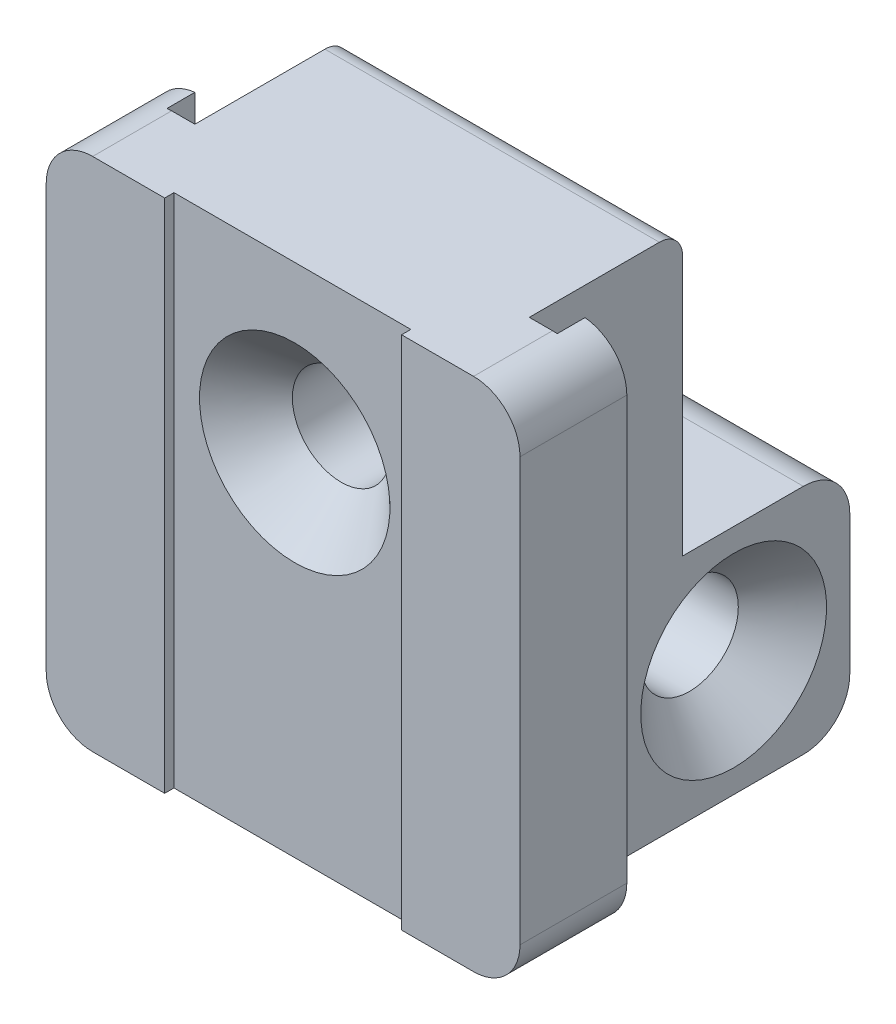
ISO-10303-21;
HEADER;
FILE_DESCRIPTION(('STEP AP214'),'2;1');
FILE_NAME('part.step','',(''),(''),'','','');
FILE_SCHEMA(('AUTOMOTIVE_DESIGN { 1 0 10303 214 1 1 1 1 }'));
ENDSEC;
DATA;
#1=APPLICATION_CONTEXT('core data for automotive mechanical design processes');
#2=APPLICATION_PROTOCOL_DEFINITION('international standard','automotive_design',2000,#1);
#3=PRODUCT_CONTEXT('',#1,'mechanical');
#4=PRODUCT('Part','Part','',(#3));
#5=PRODUCT_RELATED_PRODUCT_CATEGORY('part','',(#4));
#6=PRODUCT_DEFINITION_FORMATION('','',#4);
#7=PRODUCT_DEFINITION_CONTEXT('part definition',#1,'design');
#8=PRODUCT_DEFINITION('design','',#6,#7);
#9=PRODUCT_DEFINITION_SHAPE('','',#8);
#10=(LENGTH_UNIT() NAMED_UNIT(*) SI_UNIT(.MILLI.,.METRE.));
#11=(NAMED_UNIT(*) PLANE_ANGLE_UNIT() SI_UNIT($,.RADIAN.));
#12=(NAMED_UNIT(*) SI_UNIT($,.STERADIAN.) SOLID_ANGLE_UNIT());
#13=UNCERTAINTY_MEASURE_WITH_UNIT(LENGTH_MEASURE(1.E-05),#10,'distance_accuracy_value','');
#14=(GEOMETRIC_REPRESENTATION_CONTEXT(3) GLOBAL_UNCERTAINTY_ASSIGNED_CONTEXT((#13)) GLOBAL_UNIT_ASSIGNED_CONTEXT((#10,
#11,#12)) REPRESENTATION_CONTEXT('',''));
#15=CARTESIAN_POINT('',(0.,0.,0.));
#16=DIRECTION('',(0.,0.,1.));
#17=DIRECTION('',(1.,0.,0.));
#18=AXIS2_PLACEMENT_3D('',#15,#16,#17);
#19=CARTESIAN_POINT('',(-4.14999999999897,104.15,-2.29999999999995));
#20=DIRECTION('',(0.,0.,-1.));
#21=DIRECTION('',(0.,1.,0.));
#22=AXIS2_PLACEMENT_3D('',#19,#20,#21);
#23=CYLINDRICAL_SURFACE('',#22,1.00000000000006);
#24=CARTESIAN_POINT('',(-4.14999999999908,104.15,0.));
#25=DIRECTION('',(0.,0.,-1.));
#26=DIRECTION('',(0.,1.,0.));
#27=AXIS2_PLACEMENT_3D('',#24,#25,#26);
#28=CIRCLE('',#27,1.00000000000006);
#29=CARTESIAN_POINT('',(-4.14999999999911,103.15,0.));
#30=VERTEX_POINT('',#29);
#31=CARTESIAN_POINT('',(-5.14999999999894,104.15,0.));
#32=VERTEX_POINT('',#31);
#33=EDGE_CURVE('E193',#30,#32,#28,.T.);
#34=ORIENTED_EDGE('',*,*,#33,.T.);
#35=DIRECTION('',(0.,0.,1.));
#36=VECTOR('',#35,1.);
#37=CARTESIAN_POINT('',(-5.14999999999904,104.15,0.21499954164029));
#38=LINE('',#37,#36);
#39=CARTESIAN_POINT('',(-5.14999999999904,104.15,-2.3));
#40=VERTEX_POINT('',#39);
#41=EDGE_CURVE('E265',#40,#32,#38,.T.);
#42=ORIENTED_EDGE('',*,*,#41,.F.);
#43=CARTESIAN_POINT('',(-4.14999999999897,104.15,-2.29999999999995));
#44=DIRECTION('',(0.,0.,-1.));
#45=DIRECTION('',(0.,1.,0.));
#46=AXIS2_PLACEMENT_3D('',#43,#44,#45);
#47=CIRCLE('',#46,1.00000000000006);
#48=CARTESIAN_POINT('',(-4.24999999999907,103.155012562893,-2.29999999999998));
#49=VERTEX_POINT('',#48);
#50=EDGE_CURVE('E268',#49,#40,#47,.T.);
#51=ORIENTED_EDGE('',*,*,#50,.F.);
#52=DIRECTION('',(0.,0.,-1.));
#53=VECTOR('',#52,1.);
#54=CARTESIAN_POINT('',(-4.24999999999908,103.155012562893,-2.3));
#55=LINE('',#54,#53);
#56=CARTESIAN_POINT('',(-4.24999999999909,103.155012562893,-1.69999999999997));
#57=VERTEX_POINT('',#56);
#58=EDGE_CURVE('E204',#49,#57,#55,.F.);
#59=ORIENTED_EDGE('',*,*,#58,.T.);
#60=CARTESIAN_POINT('',(-4.14999999999899,104.15,-1.69999999999995));
#61=DIRECTION('',(0.,0.,-1.));
#62=DIRECTION('',(0.,1.,0.));
#63=AXIS2_PLACEMENT_3D('',#60,#61,#62);
#64=CIRCLE('',#63,1.00000000000006);
#65=CARTESIAN_POINT('',(-4.14999999999903,103.15,-1.7));
#66=VERTEX_POINT('',#65);
#67=EDGE_CURVE('E20',#57,#66,#64,.F.);
#68=ORIENTED_EDGE('',*,*,#67,.T.);
#69=DIRECTION('',(0.,0.,-1.));
#70=VECTOR('',#69,1.);
#71=CARTESIAN_POINT('',(-4.14999999999904,103.15,-2.3));
#72=LINE('',#71,#70);
#73=EDGE_CURVE('E185',#66,#30,#72,.F.);
#74=ORIENTED_EDGE('',*,*,#73,.T.);
#75=EDGE_LOOP('',(#34,#42,#51,#59,#68,#74));
#76=FACE_BOUND('',#75,.T.);
#77=ADVANCED_FACE('F17',(#76),#23,.T.);
#78=CARTESIAN_POINT('',(-4.14999999999877,113.25,-2.29999999999995));
#79=DIRECTION('',(0.,0.,-1.));
#80=DIRECTION('',(0.,1.,0.));
#81=AXIS2_PLACEMENT_3D('',#78,#79,#80);
#82=CYLINDRICAL_SURFACE('',#81,1.00000000000006);
#83=CARTESIAN_POINT('',(-4.14999999999889,113.25,0.));
#84=DIRECTION('',(0.,0.,-1.));
#85=DIRECTION('',(0.,1.,0.));
#86=AXIS2_PLACEMENT_3D('',#83,#84,#85);
#87=CIRCLE('',#86,1.00000000000006);
#88=CARTESIAN_POINT('',(-5.14999999999884,113.25,0.));
#89=VERTEX_POINT('',#88);
#90=CARTESIAN_POINT('',(-4.14999999999884,114.25,0.));
#91=VERTEX_POINT('',#90);
#92=EDGE_CURVE('E212',#89,#91,#87,.T.);
#93=ORIENTED_EDGE('',*,*,#92,.T.);
#94=DIRECTION('',(0.,0.,1.));
#95=VECTOR('',#94,1.);
#96=CARTESIAN_POINT('',(-4.1499999999988,114.25,-4.5));
#97=LINE('',#96,#95);
#98=CARTESIAN_POINT('',(-4.1499999999988,114.25,-1.7));
#99=VERTEX_POINT('',#98);
#100=EDGE_CURVE('E282',#91,#99,#97,.F.);
#101=ORIENTED_EDGE('',*,*,#100,.T.);
#102=CARTESIAN_POINT('',(-4.1499999999988,113.25,-1.69999999999995));
#103=DIRECTION('',(0.,0.,-1.));
#104=DIRECTION('',(0.,1.,0.));
#105=AXIS2_PLACEMENT_3D('',#102,#103,#104);
#106=CIRCLE('',#105,1.00000000000006);
#107=CARTESIAN_POINT('',(-4.24999999999895,114.244987437107,-1.69999999999998));
#108=VERTEX_POINT('',#107);
#109=EDGE_CURVE('E213',#99,#108,#106,.F.);
#110=ORIENTED_EDGE('',*,*,#109,.T.);
#111=DIRECTION('',(0.,0.,-1.));
#112=VECTOR('',#111,1.);
#113=CARTESIAN_POINT('',(-4.2499999999988,114.244987437107,-2.3));
#114=LINE('',#113,#112);
#115=CARTESIAN_POINT('',(-4.24999999999881,114.244987437107,-2.29999999999998));
#116=VERTEX_POINT('',#115);
#117=EDGE_CURVE('E210',#108,#116,#114,.T.);
#118=ORIENTED_EDGE('',*,*,#117,.T.);
#119=CARTESIAN_POINT('',(-4.14999999999877,113.25,-2.29999999999995));
#120=DIRECTION('',(0.,0.,-1.));
#121=DIRECTION('',(0.,1.,0.));
#122=AXIS2_PLACEMENT_3D('',#119,#120,#121);
#123=CIRCLE('',#122,1.00000000000006);
#124=CARTESIAN_POINT('',(-5.14999999999884,113.25,-2.3));
#125=VERTEX_POINT('',#124);
#126=EDGE_CURVE('E217',#125,#116,#123,.T.);
#127=ORIENTED_EDGE('',*,*,#126,.F.);
#128=DIRECTION('',(0.,0.,1.));
#129=VECTOR('',#128,1.);
#130=CARTESIAN_POINT('',(-5.14999999999884,113.25,0.21499954164029));
#131=LINE('',#130,#129);
#132=EDGE_CURVE('E298',#89,#125,#131,.F.);
#133=ORIENTED_EDGE('',*,*,#132,.F.);
#134=EDGE_LOOP('',(#93,#101,#110,#118,#127,#133));
#135=FACE_BOUND('',#134,.T.);
#136=ADVANCED_FACE('F499',(#135),#82,.T.);
#137=CARTESIAN_POINT('',(4.05000000000088,104.15,0.));
#138=DIRECTION('',(0.,0.,1.));
#139=DIRECTION('',(0.,-1.,0.));
#140=AXIS2_PLACEMENT_3D('',#137,#138,#139);
#141=CYLINDRICAL_SURFACE('',#140,1.00000000000001);
#142=CARTESIAN_POINT('',(4.05000000000088,104.15,-2.3));
#143=DIRECTION('',(0.,0.,1.));
#144=DIRECTION('',(0.,-1.,0.));
#145=AXIS2_PLACEMENT_3D('',#142,#143,#144);
#146=CIRCLE('',#145,1.00000000000001);
#147=CARTESIAN_POINT('',(5.05000000000096,104.15,-2.3));
#148=VERTEX_POINT('',#147);
#149=CARTESIAN_POINT('',(4.15000000000093,103.155012562893,-2.3));
#150=VERTEX_POINT('',#149);
#151=EDGE_CURVE('E262',#148,#150,#146,.F.);
#152=ORIENTED_EDGE('',*,*,#151,.F.);
#153=DIRECTION('',(0.,0.,1.));
#154=VECTOR('',#153,1.);
#155=CARTESIAN_POINT('',(5.05000000000096,104.15,-3.3));
#156=LINE('',#155,#154);
#157=CARTESIAN_POINT('',(5.05000000000095,104.15,0.));
#158=VERTEX_POINT('',#157);
#159=EDGE_CURVE('E347',#158,#148,#156,.F.);
#160=ORIENTED_EDGE('',*,*,#159,.F.);
#161=CARTESIAN_POINT('',(4.05000000000088,104.15,0.));
#162=DIRECTION('',(0.,0.,1.));
#163=DIRECTION('',(0.,-1.,0.));
#164=AXIS2_PLACEMENT_3D('',#161,#162,#163);
#165=CIRCLE('',#164,1.00000000000001);
#166=CARTESIAN_POINT('',(4.05000000000088,103.15,0.));
#167=VERTEX_POINT('',#166);
#168=EDGE_CURVE('E222',#158,#167,#165,.F.);
#169=ORIENTED_EDGE('',*,*,#168,.T.);
#170=DIRECTION('',(0.,0.,1.));
#171=VECTOR('',#170,1.);
#172=CARTESIAN_POINT('',(4.05000000000088,103.15,0.));
#173=LINE('',#172,#171);
#174=CARTESIAN_POINT('',(4.05000000000088,103.15,-1.7));
#175=VERTEX_POINT('',#174);
#176=EDGE_CURVE('E219',#167,#175,#173,.F.);
#177=ORIENTED_EDGE('',*,*,#176,.T.);
#178=CARTESIAN_POINT('',(4.05000000000088,104.15,-1.7));
#179=DIRECTION('',(0.,0.,1.));
#180=DIRECTION('',(0.,-1.,0.));
#181=AXIS2_PLACEMENT_3D('',#178,#179,#180);
#182=CIRCLE('',#181,1.00000000000001);
#183=CARTESIAN_POINT('',(4.15000000000105,103.155012562893,-1.7));
#184=VERTEX_POINT('',#183);
#185=EDGE_CURVE('E221',#175,#184,#182,.T.);
#186=ORIENTED_EDGE('',*,*,#185,.T.);
#187=DIRECTION('',(0.,0.,1.));
#188=VECTOR('',#187,1.);
#189=CARTESIAN_POINT('',(4.15000000000092,103.155012562893,0.));
#190=LINE('',#189,#188);
#191=EDGE_CURVE('E277',#184,#150,#190,.F.);
#192=ORIENTED_EDGE('',*,*,#191,.T.);
#193=EDGE_LOOP('',(#152,#160,#169,#177,#186,#192));
#194=FACE_BOUND('',#193,.T.);
#195=ADVANCED_FACE('F369',(#194),#141,.T.);
#196=CARTESIAN_POINT('',(4.05000000000104,113.25,0.));
#197=DIRECTION('',(0.,0.,1.));
#198=DIRECTION('',(1.,0.,0.));
#199=AXIS2_PLACEMENT_3D('',#196,#197,#198);
#200=CYLINDRICAL_SURFACE('',#199,1.00000000000002);
#201=CARTESIAN_POINT('',(4.05000000000104,113.25,-1.7));
#202=DIRECTION('',(0.,0.,1.));
#203=DIRECTION('',(1.,0.,0.));
#204=AXIS2_PLACEMENT_3D('',#201,#202,#203);
#205=CIRCLE('',#204,1.00000000000002);
#206=CARTESIAN_POINT('',(4.15000000000118,114.244987437107,-1.7));
#207=VERTEX_POINT('',#206);
#208=CARTESIAN_POINT('',(4.05000000000109,114.25,-1.7));
#209=VERTEX_POINT('',#208);
#210=EDGE_CURVE('E218',#207,#209,#205,.T.);
#211=ORIENTED_EDGE('',*,*,#210,.T.);
#212=DIRECTION('',(0.,0.,1.));
#213=VECTOR('',#212,1.);
#214=CARTESIAN_POINT('',(4.05000000000114,114.25,0.));
#215=LINE('',#214,#213);
#216=CARTESIAN_POINT('',(4.05000000000109,114.25,0.));
#217=VERTEX_POINT('',#216);
#218=EDGE_CURVE('E214',#209,#217,#215,.T.);
#219=ORIENTED_EDGE('',*,*,#218,.T.);
#220=CARTESIAN_POINT('',(4.05000000000104,113.25,0.));
#221=DIRECTION('',(0.,0.,1.));
#222=DIRECTION('',(1.,0.,0.));
#223=AXIS2_PLACEMENT_3D('',#220,#221,#222);
#224=CIRCLE('',#223,1.00000000000002);
#225=CARTESIAN_POINT('',(5.05000000000105,113.25,0.));
#226=VERTEX_POINT('',#225);
#227=EDGE_CURVE('E275',#217,#226,#224,.F.);
#228=ORIENTED_EDGE('',*,*,#227,.T.);
#229=DIRECTION('',(0.,0.,1.));
#230=VECTOR('',#229,1.);
#231=CARTESIAN_POINT('',(5.05000000000116,113.25,-3.3));
#232=LINE('',#231,#230);
#233=CARTESIAN_POINT('',(5.05000000000116,113.25,-2.3));
#234=VERTEX_POINT('',#233);
#235=EDGE_CURVE('E351',#234,#226,#232,.T.);
#236=ORIENTED_EDGE('',*,*,#235,.F.);
#237=CARTESIAN_POINT('',(4.05000000000104,113.25,-2.3));
#238=DIRECTION('',(0.,0.,1.));
#239=DIRECTION('',(1.,0.,0.));
#240=AXIS2_PLACEMENT_3D('',#237,#238,#239);
#241=CIRCLE('',#240,1.00000000000002);
#242=CARTESIAN_POINT('',(4.15000000000118,114.244987437107,-2.3));
#243=VERTEX_POINT('',#242);
#244=EDGE_CURVE('E266',#243,#234,#241,.F.);
#245=ORIENTED_EDGE('',*,*,#244,.F.);
#246=DIRECTION('',(0.,0.,1.));
#247=VECTOR('',#246,1.);
#248=CARTESIAN_POINT('',(4.15000000000119,114.244987437107,0.));
#249=LINE('',#248,#247);
#250=EDGE_CURVE('E208',#243,#207,#249,.T.);
#251=ORIENTED_EDGE('',*,*,#250,.T.);
#252=EDGE_LOOP('',(#211,#219,#228,#236,#245,#251));
#253=FACE_BOUND('',#252,.T.);
#254=ADVANCED_FACE('F384',(#253),#200,.T.);
#255=CARTESIAN_POINT('',(-5.14999999999907,103.15,-2.3));
#256=DIRECTION('',(0.,0.,-1.));
#257=DIRECTION('',(-1.,0.,0.));
#258=AXIS2_PLACEMENT_3D('',#255,#256,#257);
#259=PLANE('',#258);
#260=DIRECTION('',(0.,1.,0.));
#261=VECTOR('',#260,1.);
#262=CARTESIAN_POINT('',(-4.24999999999907,103.15,-2.3));
#263=LINE('',#262,#261);
#264=EDGE_CURVE('E354',#49,#116,#263,.T.);
#265=ORIENTED_EDGE('',*,*,#264,.F.);
#266=ORIENTED_EDGE('',*,*,#50,.T.);
#267=DIRECTION('',(0.,-1.,0.));
#268=VECTOR('',#267,1.);
#269=CARTESIAN_POINT('',(-5.14999999999881,114.527500599623,-2.3));
#270=LINE('',#269,#268);
#271=EDGE_CURVE('E297',#125,#40,#270,.T.);
#272=ORIENTED_EDGE('',*,*,#271,.F.);
#273=ORIENTED_EDGE('',*,*,#126,.T.);
#274=EDGE_LOOP('',(#265,#266,#272,#273));
#275=FACE_BOUND('',#274,.T.);
#276=ADVANCED_FACE('F502',(#275),#259,.T.);
#277=CARTESIAN_POINT('',(4.15000000000093,103.15,-2.3));
#278=DIRECTION('',(0.,0.,-1.));
#279=DIRECTION('',(-1.,0.,0.));
#280=AXIS2_PLACEMENT_3D('',#277,#278,#279);
#281=PLANE('',#280);
#282=DIRECTION('',(0.,1.,0.));
#283=VECTOR('',#282,1.);
#284=CARTESIAN_POINT('',(5.05000000000093,102.87249776721,-2.3));
#285=LINE('',#284,#283);
#286=EDGE_CURVE('E350',#148,#234,#285,.T.);
#287=ORIENTED_EDGE('',*,*,#286,.F.);
#288=ORIENTED_EDGE('',*,*,#151,.T.);
#289=DIRECTION('',(0.,-1.,0.));
#290=VECTOR('',#289,1.);
#291=CARTESIAN_POINT('',(4.15000000000093,103.15,-2.3));
#292=LINE('',#291,#290);
#293=EDGE_CURVE('E261',#243,#150,#292,.T.);
#294=ORIENTED_EDGE('',*,*,#293,.F.);
#295=ORIENTED_EDGE('',*,*,#244,.T.);
#296=EDGE_LOOP('',(#287,#288,#294,#295));
#297=FACE_BOUND('',#296,.T.);
#298=ADVANCED_FACE('F377',(#297),#281,.T.);
#299=CARTESIAN_POINT('',(-5.14999999999881,114.527500599623,0.21499954164029));
#300=DIRECTION('',(-1.,0.,0.));
#301=DIRECTION('',(0.,-1.,0.));
#302=AXIS2_PLACEMENT_3D('',#299,#300,#301);
#303=PLANE('',#302);
#304=ORIENTED_EDGE('',*,*,#132,.T.);
#305=ORIENTED_EDGE('',*,*,#271,.T.);
#306=ORIENTED_EDGE('',*,*,#41,.T.);
#307=DIRECTION('',(0.,-1.,0.));
#308=VECTOR('',#307,1.);
#309=CARTESIAN_POINT('',(-5.14999999999885,114.25,0.));
#310=LINE('',#309,#308);
#311=EDGE_CURVE('E254',#89,#32,#310,.T.);
#312=ORIENTED_EDGE('',*,*,#311,.F.);
#313=EDGE_LOOP('',(#304,#305,#306,#312));
#314=FACE_BOUND('',#313,.T.);
#315=ADVANCED_FACE('F295',(#314),#303,.T.);
#316=CARTESIAN_POINT('',(5.05000000000093,102.87249776721,-3.3));
#317=DIRECTION('',(1.,0.,0.));
#318=DIRECTION('',(0.,1.,0.));
#319=AXIS2_PLACEMENT_3D('',#316,#317,#318);
#320=PLANE('',#319);
#321=ORIENTED_EDGE('',*,*,#235,.T.);
#322=DIRECTION('',(0.,-1.,0.));
#323=VECTOR('',#322,1.);
#324=CARTESIAN_POINT('',(5.05000000000094,114.25,0.));
#325=LINE('',#324,#323);
#326=EDGE_CURVE('E389',#158,#226,#325,.F.);
#327=ORIENTED_EDGE('',*,*,#326,.F.);
#328=ORIENTED_EDGE('',*,*,#159,.T.);
#329=ORIENTED_EDGE('',*,*,#286,.T.);
#330=EDGE_LOOP('',(#321,#327,#328,#329));
#331=FACE_BOUND('',#330,.T.);
#332=ADVANCED_FACE('F388',(#331),#320,.T.);
#333=CARTESIAN_POINT('',(-4.24999999999907,103.15,-2.3));
#334=DIRECTION('',(1.,0.,0.));
#335=DIRECTION('',(0.,1.,0.));
#336=AXIS2_PLACEMENT_3D('',#333,#334,#335);
#337=PLANE('',#336);
#338=DIRECTION('',(0.,1.,0.));
#339=VECTOR('',#338,1.);
#340=CARTESIAN_POINT('',(-4.24999999999907,103.15,-1.7));
#341=LINE('',#340,#339);
#342=EDGE_CURVE('E200',#57,#108,#341,.T.);
#343=ORIENTED_EDGE('',*,*,#342,.F.);
#344=ORIENTED_EDGE('',*,*,#58,.F.);
#345=ORIENTED_EDGE('',*,*,#264,.T.);
#346=ORIENTED_EDGE('',*,*,#117,.F.);
#347=EDGE_LOOP('',(#343,#344,#345,#346));
#348=FACE_BOUND('',#347,.T.);
#349=ADVANCED_FACE('F504',(#348),#337,.T.);
#350=CARTESIAN_POINT('',(4.15000000000093,103.15,-1.7));
#351=DIRECTION('',(-1.,0.,0.));
#352=DIRECTION('',(0.,-1.,0.));
#353=AXIS2_PLACEMENT_3D('',#350,#351,#352);
#354=PLANE('',#353);
#355=ORIENTED_EDGE('',*,*,#293,.T.);
#356=ORIENTED_EDGE('',*,*,#191,.F.);
#357=DIRECTION('',(0.,1.,0.));
#358=VECTOR('',#357,1.);
#359=CARTESIAN_POINT('',(4.15000000000118,103.15,-1.7));
#360=LINE('',#359,#358);
#361=EDGE_CURVE('E381',#207,#184,#360,.F.);
#362=ORIENTED_EDGE('',*,*,#361,.F.);
#363=ORIENTED_EDGE('',*,*,#250,.F.);
#364=EDGE_LOOP('',(#355,#356,#362,#363));
#365=FACE_BOUND('',#364,.T.);
#366=ADVANCED_FACE('F378',(#365),#354,.T.);
#367=CARTESIAN_POINT('',(-5.14999999999902,107.15,-7.6));
#368=DIRECTION('',(-1.,0.,0.));
#369=DIRECTION('',(0.,-1.,0.));
#370=AXIS2_PLACEMENT_3D('',#367,#368,#369);
#371=CYLINDRICAL_SURFACE('',#370,1.00000000000002);
#372=CARTESIAN_POINT('',(3.55000000000098,107.149999999999,-7.5999999999996));
#373=DIRECTION('',(-1.,0.,0.));
#374=DIRECTION('',(0.,-1.,0.));
#375=AXIS2_PLACEMENT_3D('',#372,#373,#374);
#376=CIRCLE('',#375,1.00000000000002);
#377=CARTESIAN_POINT('',(3.55000000000104,108.15,-7.5999999999998));
#378=VERTEX_POINT('',#377);
#379=CARTESIAN_POINT('',(3.55000000000102,107.15,-8.6));
#380=VERTEX_POINT('',#379);
#381=EDGE_CURVE('E257',#378,#380,#376,.T.);
#382=ORIENTED_EDGE('',*,*,#381,.T.);
#383=DIRECTION('',(-1.,0.,0.));
#384=VECTOR('',#383,1.);
#385=CARTESIAN_POINT('',(-5.14999999999906,107.15,-8.6));
#386=LINE('',#385,#384);
#387=CARTESIAN_POINT('',(-3.64999999999898,107.15,-8.6));
#388=VERTEX_POINT('',#387);
#389=EDGE_CURVE('E419',#388,#380,#386,.F.);
#390=ORIENTED_EDGE('',*,*,#389,.F.);
#391=CARTESIAN_POINT('',(-3.64999999999902,107.15,-7.59999999999993));
#392=DIRECTION('',(-1.,0.,0.));
#393=DIRECTION('',(0.,-1.,0.));
#394=AXIS2_PLACEMENT_3D('',#391,#392,#393);
#395=CIRCLE('',#394,1.00000000000002);
#396=CARTESIAN_POINT('',(-3.64999999999896,108.15,-7.59999999999996));
#397=VERTEX_POINT('',#396);
#398=EDGE_CURVE('E259',#388,#397,#395,.F.);
#399=ORIENTED_EDGE('',*,*,#398,.T.);
#400=DIRECTION('',(1.,0.,0.));
#401=VECTOR('',#400,1.);
#402=CARTESIAN_POINT('',(-5.14999999999895,108.15,-7.6));
#403=LINE('',#402,#401);
#404=EDGE_CURVE('E424',#378,#397,#403,.F.);
#405=ORIENTED_EDGE('',*,*,#404,.F.);
#406=EDGE_LOOP('',(#382,#390,#399,#405));
#407=FACE_BOUND('',#406,.T.);
#408=ADVANCED_FACE('F581',(#407),#371,.T.);
#409=CARTESIAN_POINT('',(-3.69999999999904,105.65,-6.1));
#410=DIRECTION('',(-1.,0.,0.));
#411=DIRECTION('',(0.,-1.,0.));
#412=AXIS2_PLACEMENT_3D('',#409,#410,#411);
#413=CYLINDRICAL_SURFACE('',#412,1.04999999999997);
#414=CARTESIAN_POINT('',(-2.70000000000437,105.65,-6.1));
#415=DIRECTION('',(-1.,0.,0.));
#416=DIRECTION('',(0.,0.,1.));
#417=AXIS2_PLACEMENT_3D('',#414,#415,#416);
#418=CIRCLE('',#417,1.0500000000171);
#419=CARTESIAN_POINT('',(-2.70000000000437,105.65,-5.0499999999829));
#420=VERTEX_POINT('',#419);
#421=EDGE_CURVE('E199',#420,#420,#418,.T.);
#422=ORIENTED_EDGE('',*,*,#421,.T.);
#423=EDGE_LOOP('',(#422));
#424=FACE_BOUND('',#423,.T.);
#425=CARTESIAN_POINT('',(2.60000000002947,105.65,-6.1));
#426=DIRECTION('',(1.,0.,0.));
#427=DIRECTION('',(0.,0.,-1.));
#428=AXIS2_PLACEMENT_3D('',#425,#426,#427);
#429=CIRCLE('',#428,1.05000000002419);
#430=CARTESIAN_POINT('',(2.60000000002947,105.65,-7.15000000002419));
#431=VERTEX_POINT('',#430);
#432=EDGE_CURVE('E250',#431,#431,#429,.T.);
#433=ORIENTED_EDGE('',*,*,#432,.T.);
#434=EDGE_LOOP('',(#433));
#435=FACE_BOUND('',#434,.T.);
#436=ADVANCED_FACE('F589',(#424,#435),#413,.F.);
#437=CARTESIAN_POINT('',(-5.14999999999888,113.75,-4.50000000000007));
#438=DIRECTION('',(-1.,1.137225621832E-13,0.));
#439=DIRECTION('',(-1.137225621832E-13,-1.,0.));
#440=AXIS2_PLACEMENT_3D('',#437,#438,#439);
#441=CYLINDRICAL_SURFACE('',#440,0.5);
#442=CARTESIAN_POINT('',(3.55000000000112,113.749999999999,-4.49999999999927));
#443=DIRECTION('',(-1.,1.137225621832E-13,0.));
#444=DIRECTION('',(-1.137225621832E-13,-1.,0.));
#445=AXIS2_PLACEMENT_3D('',#442,#443,#444);
#446=CIRCLE('',#445,0.5);
#447=CARTESIAN_POINT('',(3.55000000000118,114.25,-4.49999999999963));
#448=VERTEX_POINT('',#447);
#449=CARTESIAN_POINT('',(3.55000000000117,113.75,-5.));
#450=VERTEX_POINT('',#449);
#451=EDGE_CURVE('E252',#448,#450,#446,.T.);
#452=ORIENTED_EDGE('',*,*,#451,.T.);
#453=DIRECTION('',(-1.,0.,0.));
#454=VECTOR('',#453,1.);
#455=CARTESIAN_POINT('',(-5.14999999999895,113.75,-5.));
#456=LINE('',#455,#454);
#457=CARTESIAN_POINT('',(-3.64999999999883,113.75,-5.));
#458=VERTEX_POINT('',#457);
#459=EDGE_CURVE('E427',#458,#450,#456,.F.);
#460=ORIENTED_EDGE('',*,*,#459,.F.);
#461=CARTESIAN_POINT('',(-3.64999999999888,113.75,-4.49999999999993));
#462=DIRECTION('',(-1.,1.137225621832E-13,0.));
#463=DIRECTION('',(-1.137225621832E-13,-1.,0.));
#464=AXIS2_PLACEMENT_3D('',#461,#462,#463);
#465=CIRCLE('',#464,0.5);
#466=CARTESIAN_POINT('',(-3.64999999999882,114.25,-4.49999999999997));
#467=VERTEX_POINT('',#466);
#468=EDGE_CURVE('E255',#458,#467,#465,.F.);
#469=ORIENTED_EDGE('',*,*,#468,.T.);
#470=DIRECTION('',(1.,0.,0.));
#471=VECTOR('',#470,1.);
#472=CARTESIAN_POINT('',(-5.14999999999883,114.25,-4.5));
#473=LINE('',#472,#471);
#474=EDGE_CURVE('E409',#448,#467,#473,.F.);
#475=ORIENTED_EDGE('',*,*,#474,.F.);
#476=EDGE_LOOP('',(#452,#460,#469,#475));
#477=FACE_BOUND('',#476,.T.);
#478=ADVANCED_FACE('F587',(#477),#441,.T.);
#479=CARTESIAN_POINT('',(-5.14999999999883,114.25,0.));
#480=DIRECTION('',(0.,0.,1.));
#481=DIRECTION('',(0.,-1.,0.));
#482=AXIS2_PLACEMENT_3D('',#479,#480,#481);
#483=PLANE('',#482);
#484=ORIENTED_EDGE('',*,*,#33,.F.);
#485=DIRECTION('',(1.,0.,0.));
#486=VECTOR('',#485,1.);
#487=CARTESIAN_POINT('',(-5.14999999999883,103.15,0.));
#488=LINE('',#487,#486);
#489=CARTESIAN_POINT('',(-2.59999999999907,103.15,0.));
#490=VERTEX_POINT('',#489);
#491=EDGE_CURVE('E191',#30,#490,#488,.T.);
#492=ORIENTED_EDGE('',*,*,#491,.T.);
#493=DIRECTION('',(0.,1.,0.));
#494=VECTOR('',#493,1.);
#495=CARTESIAN_POINT('',(-2.59999999999907,103.15,0.));
#496=LINE('',#495,#494);
#497=CARTESIAN_POINT('',(-2.59999999999888,114.25,0.));
#498=VERTEX_POINT('',#497);
#499=EDGE_CURVE('E315',#498,#490,#496,.F.);
#500=ORIENTED_EDGE('',*,*,#499,.F.);
#501=DIRECTION('',(1.,0.,0.));
#502=VECTOR('',#501,1.);
#503=CARTESIAN_POINT('',(-5.14999999999883,114.25,0.));
#504=LINE('',#503,#502);
#505=EDGE_CURVE('E309',#91,#498,#504,.T.);
#506=ORIENTED_EDGE('',*,*,#505,.F.);
#507=ORIENTED_EDGE('',*,*,#92,.F.);
#508=ORIENTED_EDGE('',*,*,#311,.T.);
#509=EDGE_LOOP('',(#484,#492,#500,#506,#507,#508));
#510=FACE_BOUND('',#509,.T.);
#511=ADVANCED_FACE('F300',(#510),#483,.T.);
#512=CARTESIAN_POINT('',(-5.14999999999883,114.25,0.));
#513=DIRECTION('',(0.,0.,1.));
#514=DIRECTION('',(0.,-1.,0.));
#515=AXIS2_PLACEMENT_3D('',#512,#513,#514);
#516=PLANE('',#515);
#517=ORIENTED_EDGE('',*,*,#227,.F.);
#518=DIRECTION('',(1.,0.,0.));
#519=VECTOR('',#518,1.);
#520=CARTESIAN_POINT('',(-5.14999999999883,114.25,0.));
#521=LINE('',#520,#519);
#522=CARTESIAN_POINT('',(2.50000000000118,114.25,0.));
#523=VERTEX_POINT('',#522);
#524=EDGE_CURVE('E326',#523,#217,#521,.T.);
#525=ORIENTED_EDGE('',*,*,#524,.F.);
#526=DIRECTION('',(0.,-1.,0.));
#527=VECTOR('',#526,1.);
#528=CARTESIAN_POINT('',(2.50000000000118,114.25,0.));
#529=LINE('',#528,#527);
#530=CARTESIAN_POINT('',(2.50000000000106,103.15,0.));
#531=VERTEX_POINT('',#530);
#532=EDGE_CURVE('E336',#531,#523,#529,.F.);
#533=ORIENTED_EDGE('',*,*,#532,.F.);
#534=DIRECTION('',(1.,0.,0.));
#535=VECTOR('',#534,1.);
#536=CARTESIAN_POINT('',(-5.14999999999883,103.15,0.));
#537=LINE('',#536,#535);
#538=EDGE_CURVE('E304',#531,#167,#537,.T.);
#539=ORIENTED_EDGE('',*,*,#538,.T.);
#540=ORIENTED_EDGE('',*,*,#168,.F.);
#541=ORIENTED_EDGE('',*,*,#326,.T.);
#542=EDGE_LOOP('',(#517,#525,#533,#539,#540,#541));
#543=FACE_BOUND('',#542,.T.);
#544=ADVANCED_FACE('F392',(#543),#516,.T.);
#545=CARTESIAN_POINT('',(1.10658409661932E-12,110.7,-5.));
#546=DIRECTION('',(0.,0.,-1.));
#547=DIRECTION('',(-1.,0.,0.));
#548=AXIS2_PLACEMENT_3D('',#545,#546,#547);
#549=CYLINDRICAL_SURFACE('',#548,1.05);
#550=CARTESIAN_POINT('',(1.10658409661932E-12,110.7,-5.));
#551=DIRECTION('',(0.,0.,-1.));
#552=DIRECTION('',(-1.,0.,0.));
#553=AXIS2_PLACEMENT_3D('',#550,#551,#552);
#554=CIRCLE('',#553,1.05);
#555=CARTESIAN_POINT('',(-1.04999999999889,110.7,-5.));
#556=VERTEX_POINT('',#555);
#557=EDGE_CURVE('E247',#556,#556,#554,.F.);
#558=ORIENTED_EDGE('',*,*,#557,.F.);
#559=EDGE_LOOP('',(#558));
#560=FACE_BOUND('',#559,.T.);
#561=CARTESIAN_POINT('',(1.10117663828405E-12,110.7,-1.20000000003984));
#562=DIRECTION('',(0.,0.,1.));
#563=DIRECTION('',(1.,0.,0.));
#564=AXIS2_PLACEMENT_3D('',#561,#562,#563);
#565=CIRCLE('',#564,1.05000000001954);
#566=CARTESIAN_POINT('',(1.05000000002065,110.7,-1.20000000003984));
#567=VERTEX_POINT('',#566);
#568=EDGE_CURVE('E339',#567,#567,#565,.T.);
#569=ORIENTED_EDGE('',*,*,#568,.T.);
#570=EDGE_LOOP('',(#569));
#571=FACE_BOUND('',#570,.T.);
#572=ADVANCED_FACE('F725',(#560,#571),#549,.F.);
#573=CARTESIAN_POINT('',(-4.24999999999907,103.15,-1.7));
#574=DIRECTION('',(0.,0.,-1.));
#575=DIRECTION('',(-1.,0.,0.));
#576=AXIS2_PLACEMENT_3D('',#573,#574,#575);
#577=PLANE('',#576);
#578=DIRECTION('',(-1.,0.,0.));
#579=VECTOR('',#578,1.);
#580=CARTESIAN_POINT('',(-4.24999999999907,103.15,-1.7));
#581=LINE('',#580,#579);
#582=CARTESIAN_POINT('',(-3.64999999999899,103.15,-1.7));
#583=VERTEX_POINT('',#582);
#584=EDGE_CURVE('E188',#583,#66,#581,.T.);
#585=ORIENTED_EDGE('',*,*,#584,.T.);
#586=ORIENTED_EDGE('',*,*,#67,.F.);
#587=ORIENTED_EDGE('',*,*,#342,.T.);
#588=ORIENTED_EDGE('',*,*,#109,.F.);
#589=DIRECTION('',(1.,0.,0.));
#590=VECTOR('',#589,1.);
#591=CARTESIAN_POINT('',(-5.14999999999883,114.25,-1.7));
#592=LINE('',#591,#590);
#593=CARTESIAN_POINT('',(-3.64999999999882,114.25,-1.7));
#594=VERTEX_POINT('',#593);
#595=EDGE_CURVE('E312',#594,#99,#592,.F.);
#596=ORIENTED_EDGE('',*,*,#595,.F.);
#597=DIRECTION('',(0.,-1.,0.));
#598=VECTOR('',#597,1.);
#599=CARTESIAN_POINT('',(-3.64999999999907,103.15,-1.7));
#600=LINE('',#599,#598);
#601=EDGE_CURVE('E197',#583,#594,#600,.F.);
#602=ORIENTED_EDGE('',*,*,#601,.F.);
#603=EDGE_LOOP('',(#585,#586,#587,#588,#596,#602));
#604=FACE_BOUND('',#603,.T.);
#605=ADVANCED_FACE('F195',(#604),#577,.T.);
#606=CARTESIAN_POINT('',(-3.64999999987958,105.65,-6.1));
#607=DIRECTION('',(-1.,0.,0.));
#608=DIRECTION('',(0.,-1.,0.));
#609=AXIS2_PLACEMENT_3D('',#606,#607,#608);
#610=CONICAL_SURFACE('',#609,1.99999999989232,0.785398163397448);
#611=ORIENTED_EDGE('',*,*,#421,.F.);
#612=EDGE_LOOP('',(#611));
#613=FACE_BOUND('',#612,.T.);
#614=CARTESIAN_POINT('',(-3.65000000005011,105.65,-6.1));
#615=DIRECTION('',(-1.,0.,0.));
#616=DIRECTION('',(0.,-1.,0.));
#617=AXIS2_PLACEMENT_3D('',#614,#615,#616);
#618=CIRCLE('',#617,2.00000000006285);
#619=CARTESIAN_POINT('',(-3.65000000005016,103.649999999937,-6.1));
#620=VERTEX_POINT('',#619);
#621=EDGE_CURVE('E243',#620,#620,#618,.F.);
#622=ORIENTED_EDGE('',*,*,#621,.F.);
#623=EDGE_LOOP('',(#622));
#624=FACE_BOUND('',#623,.T.);
#625=ADVANCED_FACE('F525',(#613,#624),#610,.F.);
#626=CARTESIAN_POINT('',(3.55000000000093,103.15,-1.7));
#627=DIRECTION('',(0.,0.,-1.));
#628=DIRECTION('',(-1.,0.,0.));
#629=AXIS2_PLACEMENT_3D('',#626,#627,#628);
#630=PLANE('',#629);
#631=ORIENTED_EDGE('',*,*,#361,.T.);
#632=ORIENTED_EDGE('',*,*,#185,.F.);
#633=DIRECTION('',(-1.,0.,0.));
#634=VECTOR('',#633,1.);
#635=CARTESIAN_POINT('',(3.55000000000093,103.15,-1.7));
#636=LINE('',#635,#634);
#637=CARTESIAN_POINT('',(3.55000000000093,103.15,-1.7));
#638=VERTEX_POINT('',#637);
#639=EDGE_CURVE('E346',#175,#638,#636,.T.);
#640=ORIENTED_EDGE('',*,*,#639,.T.);
#641=DIRECTION('',(0.,1.,0.));
#642=VECTOR('',#641,1.);
#643=CARTESIAN_POINT('',(3.55000000000093,103.15,-1.7));
#644=LINE('',#643,#642);
#645=CARTESIAN_POINT('',(3.55000000000118,114.25,-1.7));
#646=VERTEX_POINT('',#645);
#647=EDGE_CURVE('E238',#646,#638,#644,.F.);
#648=ORIENTED_EDGE('',*,*,#647,.F.);
#649=DIRECTION('',(1.,0.,0.));
#650=VECTOR('',#649,1.);
#651=CARTESIAN_POINT('',(-5.14999999999883,114.25,-1.7));
#652=LINE('',#651,#650);
#653=EDGE_CURVE('E329',#209,#646,#652,.F.);
#654=ORIENTED_EDGE('',*,*,#653,.F.);
#655=ORIENTED_EDGE('',*,*,#210,.F.);
#656=EDGE_LOOP('',(#631,#632,#640,#648,#654,#655));
#657=FACE_BOUND('',#656,.T.);
#658=ADVANCED_FACE('F522',(#657),#630,.T.);
#659=CARTESIAN_POINT('',(-5.14999999999906,104.15,-8.6));
#660=DIRECTION('',(0.,0.,-1.));
#661=DIRECTION('',(-1.,0.,0.));
#662=AXIS2_PLACEMENT_3D('',#659,#660,#661);
#663=PLANE('',#662);
#664=DIRECTION('',(0.,1.,0.));
#665=VECTOR('',#664,1.);
#666=CARTESIAN_POINT('',(3.55000000000093,103.15,-8.6));
#667=LINE('',#666,#665);
#668=CARTESIAN_POINT('',(3.55000000000095,104.15,-8.5999999999998));
#669=VERTEX_POINT('',#668);
#670=EDGE_CURVE('E237',#669,#380,#667,.T.);
#671=ORIENTED_EDGE('',*,*,#670,.F.);
#672=DIRECTION('',(-1.,0.,0.));
#673=VECTOR('',#672,1.);
#674=CARTESIAN_POINT('',(-5.14999999999901,104.15,-8.59999999999999));
#675=LINE('',#674,#673);
#676=CARTESIAN_POINT('',(-3.64999999999904,104.15,-8.59999999999996));
#677=VERTEX_POINT('',#676);
#678=EDGE_CURVE('E242',#677,#669,#675,.F.);
#679=ORIENTED_EDGE('',*,*,#678,.F.);
#680=DIRECTION('',(0.,-1.,0.));
#681=VECTOR('',#680,1.);
#682=CARTESIAN_POINT('',(-3.64999999999907,103.15,-8.6));
#683=LINE('',#682,#681);
#684=EDGE_CURVE('E436',#388,#677,#683,.T.);
#685=ORIENTED_EDGE('',*,*,#684,.F.);
#686=ORIENTED_EDGE('',*,*,#389,.T.);
#687=EDGE_LOOP('',(#671,#679,#685,#686));
#688=FACE_BOUND('',#687,.T.);
#689=ADVANCED_FACE('F524',(#688),#663,.T.);
#690=CARTESIAN_POINT('',(-5.14999999999895,108.15,-7.6));
#691=DIRECTION('',(0.,1.,0.));
#692=DIRECTION('',(0.,0.,1.));
#693=AXIS2_PLACEMENT_3D('',#690,#691,#692);
#694=PLANE('',#693);
#695=DIRECTION('',(0.,0.,1.));
#696=VECTOR('',#695,1.);
#697=CARTESIAN_POINT('',(3.55000000000104,108.15,-9.210087612571));
#698=LINE('',#697,#696);
#699=CARTESIAN_POINT('',(3.55000000000104,108.15,-5.));
#700=VERTEX_POINT('',#699);
#701=EDGE_CURVE('E471',#378,#700,#698,.T.);
#702=ORIENTED_EDGE('',*,*,#701,.F.);
#703=ORIENTED_EDGE('',*,*,#404,.T.);
#704=DIRECTION('',(0.,0.,1.));
#705=VECTOR('',#704,1.);
#706=CARTESIAN_POINT('',(-3.64999999999896,108.15,-1.7));
#707=LINE('',#706,#705);
#708=CARTESIAN_POINT('',(-3.64999999999896,108.15,-5.));
#709=VERTEX_POINT('',#708);
#710=EDGE_CURVE('E441',#709,#397,#707,.F.);
#711=ORIENTED_EDGE('',*,*,#710,.F.);
#712=DIRECTION('',(-1.,0.,0.));
#713=VECTOR('',#712,1.);
#714=CARTESIAN_POINT('',(-5.14999999999895,108.15,-5.));
#715=LINE('',#714,#713);
#716=EDGE_CURVE('E251',#700,#709,#715,.T.);
#717=ORIENTED_EDGE('',*,*,#716,.F.);
#718=EDGE_LOOP('',(#702,#703,#711,#717));
#719=FACE_BOUND('',#718,.T.);
#720=ADVANCED_FACE('F532',(#719),#694,.T.);
#721=CARTESIAN_POINT('',(-5.14999999999895,108.15,-5.));
#722=DIRECTION('',(0.,0.,-1.));
#723=DIRECTION('',(-1.,0.,0.));
#724=AXIS2_PLACEMENT_3D('',#721,#722,#723);
#725=PLANE('',#724);
#726=ORIENTED_EDGE('',*,*,#557,.T.);
#727=EDGE_LOOP('',(#726));
#728=FACE_BOUND('',#727,.T.);
#729=DIRECTION('',(0.,1.,0.));
#730=VECTOR('',#729,1.);
#731=CARTESIAN_POINT('',(3.55000000000093,103.15,-5.));
#732=LINE('',#731,#730);
#733=EDGE_CURVE('E233',#700,#450,#732,.T.);
#734=ORIENTED_EDGE('',*,*,#733,.F.);
#735=ORIENTED_EDGE('',*,*,#716,.T.);
#736=DIRECTION('',(0.,-1.,0.));
#737=VECTOR('',#736,1.);
#738=CARTESIAN_POINT('',(-3.64999999999907,103.15,-5.));
#739=LINE('',#738,#737);
#740=EDGE_CURVE('E401',#458,#709,#739,.T.);
#741=ORIENTED_EDGE('',*,*,#740,.F.);
#742=ORIENTED_EDGE('',*,*,#459,.T.);
#743=EDGE_LOOP('',(#734,#735,#741,#742));
#744=FACE_BOUND('',#743,.T.);
#745=ADVANCED_FACE('F566',(#728,#744),#725,.T.);
#746=CARTESIAN_POINT('',(3.54999999990468,105.65,-6.1));
#747=DIRECTION('',(1.,0.,0.));
#748=DIRECTION('',(0.,1.,0.));
#749=AXIS2_PLACEMENT_3D('',#746,#747,#748);
#750=CONICAL_SURFACE('',#749,1.99999999989941,0.785398163397448);
#751=ORIENTED_EDGE('',*,*,#432,.F.);
#752=EDGE_LOOP('',(#751));
#753=FACE_BOUND('',#752,.T.);
#754=CARTESIAN_POINT('',(3.54999999996153,105.65,-6.1));
#755=DIRECTION('',(1.,0.,0.));
#756=DIRECTION('',(0.,1.,0.));
#757=AXIS2_PLACEMENT_3D('',#754,#755,#756);
#758=CIRCLE('',#757,1.99999999995625);
#759=CARTESIAN_POINT('',(3.54999999996157,107.649999999956,-6.1));
#760=VERTEX_POINT('',#759);
#761=EDGE_CURVE('E229',#760,#760,#758,.F.);
#762=ORIENTED_EDGE('',*,*,#761,.F.);
#763=EDGE_LOOP('',(#762));
#764=FACE_BOUND('',#763,.T.);
#765=ADVANCED_FACE('F563',(#753,#764),#750,.F.);
#766=CARTESIAN_POINT('',(-5.14999999999883,114.25,-4.5));
#767=DIRECTION('',(0.,1.,0.));
#768=DIRECTION('',(0.,0.,1.));
#769=AXIS2_PLACEMENT_3D('',#766,#767,#768);
#770=PLANE('',#769);
#771=ORIENTED_EDGE('',*,*,#100,.F.);
#772=ORIENTED_EDGE('',*,*,#505,.T.);
#773=DIRECTION('',(0.,0.,1.));
#774=VECTOR('',#773,1.);
#775=CARTESIAN_POINT('',(-2.59999999999882,114.25,0.));
#776=LINE('',#775,#774);
#777=CARTESIAN_POINT('',(-2.59999999999882,114.25,-0.2));
#778=VERTEX_POINT('',#777);
#779=EDGE_CURVE('E319',#778,#498,#776,.T.);
#780=ORIENTED_EDGE('',*,*,#779,.F.);
#781=DIRECTION('',(1.,0.,0.));
#782=VECTOR('',#781,1.);
#783=CARTESIAN_POINT('',(2.62750001512588,114.25,-0.2));
#784=LINE('',#783,#782);
#785=CARTESIAN_POINT('',(2.50000000000112,114.25,-0.2));
#786=VERTEX_POINT('',#785);
#787=EDGE_CURVE('E232',#786,#778,#784,.F.);
#788=ORIENTED_EDGE('',*,*,#787,.F.);
#789=DIRECTION('',(0.,0.,1.));
#790=VECTOR('',#789,1.);
#791=CARTESIAN_POINT('',(2.50000000000118,114.25,0.));
#792=LINE('',#791,#790);
#793=EDGE_CURVE('E318',#523,#786,#792,.F.);
#794=ORIENTED_EDGE('',*,*,#793,.F.);
#795=ORIENTED_EDGE('',*,*,#524,.T.);
#796=ORIENTED_EDGE('',*,*,#218,.F.);
#797=ORIENTED_EDGE('',*,*,#653,.T.);
#798=DIRECTION('',(0.,0.,1.));
#799=VECTOR('',#798,1.);
#800=CARTESIAN_POINT('',(3.55000000000118,114.25,-9.210087612571));
#801=LINE('',#800,#799);
#802=EDGE_CURVE('E421',#448,#646,#801,.T.);
#803=ORIENTED_EDGE('',*,*,#802,.F.);
#804=ORIENTED_EDGE('',*,*,#474,.T.);
#805=DIRECTION('',(0.,0.,1.));
#806=VECTOR('',#805,1.);
#807=CARTESIAN_POINT('',(-3.64999999999882,114.25,-1.7));
#808=LINE('',#807,#806);
#809=EDGE_CURVE('E246',#594,#467,#808,.F.);
#810=ORIENTED_EDGE('',*,*,#809,.F.);
#811=ORIENTED_EDGE('',*,*,#595,.T.);
#812=EDGE_LOOP('',(#771,#772,#780,#788,#794,#795,#796,#797,#803,#804,#810,#811));
#813=FACE_BOUND('',#812,.T.);
#814=ADVANCED_FACE('F493',(#813),#770,.T.);
#815=CARTESIAN_POINT('',(-2.59999999999907,103.15,0.));
#816=DIRECTION('',(1.,0.,0.));
#817=DIRECTION('',(0.,1.,0.));
#818=AXIS2_PLACEMENT_3D('',#815,#816,#817);
#819=PLANE('',#818);
#820=ORIENTED_EDGE('',*,*,#779,.T.);
#821=ORIENTED_EDGE('',*,*,#499,.T.);
#822=DIRECTION('',(0.,0.,1.));
#823=VECTOR('',#822,1.);
#824=CARTESIAN_POINT('',(-2.59999999999907,103.15,0.));
#825=LINE('',#824,#823);
#826=CARTESIAN_POINT('',(-2.59999999999901,103.15,-0.2));
#827=VERTEX_POINT('',#826);
#828=EDGE_CURVE('E311',#490,#827,#825,.F.);
#829=ORIENTED_EDGE('',*,*,#828,.T.);
#830=DIRECTION('',(0.,1.,0.));
#831=VECTOR('',#830,1.);
#832=CARTESIAN_POINT('',(-2.59999999999882,114.527499553561,-0.2));
#833=LINE('',#832,#831);
#834=EDGE_CURVE('E482',#778,#827,#833,.F.);
#835=ORIENTED_EDGE('',*,*,#834,.F.);
#836=EDGE_LOOP('',(#820,#821,#829,#835));
#837=FACE_BOUND('',#836,.T.);
#838=ADVANCED_FACE('F497',(#837),#819,.T.);
#839=CARTESIAN_POINT('',(2.50000000000118,114.25,0.));
#840=DIRECTION('',(-1.,0.,0.));
#841=DIRECTION('',(0.,-1.,0.));
#842=AXIS2_PLACEMENT_3D('',#839,#840,#841);
#843=PLANE('',#842);
#844=DIRECTION('',(0.,0.,1.));
#845=VECTOR('',#844,1.);
#846=CARTESIAN_POINT('',(2.50000000000094,103.15,0.));
#847=LINE('',#846,#845);
#848=CARTESIAN_POINT('',(2.50000000000093,103.15,-0.2));
#849=VERTEX_POINT('',#848);
#850=EDGE_CURVE('E34',#849,#531,#847,.T.);
#851=ORIENTED_EDGE('',*,*,#850,.T.);
#852=ORIENTED_EDGE('',*,*,#532,.T.);
#853=ORIENTED_EDGE('',*,*,#793,.T.);
#854=DIRECTION('',(0.,1.,0.));
#855=VECTOR('',#854,1.);
#856=CARTESIAN_POINT('',(2.50000000000093,114.527499553561,-0.2));
#857=LINE('',#856,#855);
#858=EDGE_CURVE('E228',#849,#786,#857,.T.);
#859=ORIENTED_EDGE('',*,*,#858,.F.);
#860=EDGE_LOOP('',(#851,#852,#853,#859));
#861=FACE_BOUND('',#860,.T.);
#862=ADVANCED_FACE('F490',(#861),#843,.T.);
#863=CARTESIAN_POINT('',(1.10111572637628E-12,110.7,-0.200000000120326));
#864=DIRECTION('',(0.,0.,1.));
#865=DIRECTION('',(0.,-1.,0.));
#866=AXIS2_PLACEMENT_3D('',#863,#864,#865);
#867=CONICAL_SURFACE('',#866,2.04999999993905,0.78539816342587);
#868=ORIENTED_EDGE('',*,*,#568,.F.);
#869=EDGE_LOOP('',(#868));
#870=FACE_BOUND('',#869,.T.);
#871=CARTESIAN_POINT('',(1.10111572637628E-12,110.7,-0.200000000062382));
#872=DIRECTION('',(0.,0.,1.));
#873=DIRECTION('',(0.,-1.,0.));
#874=AXIS2_PLACEMENT_3D('',#871,#872,#873);
#875=CIRCLE('',#874,2.049999999997);
#876=CARTESIAN_POINT('',(1.10111572637628E-12,108.650000000003,-0.200000000062382));
#877=VERTEX_POINT('',#876);
#878=EDGE_CURVE('E224',#877,#877,#875,.F.);
#879=ORIENTED_EDGE('',*,*,#878,.F.);
#880=EDGE_LOOP('',(#879));
#881=FACE_BOUND('',#880,.T.);
#882=ADVANCED_FACE('F552',(#870,#881),#867,.F.);
#883=CARTESIAN_POINT('',(-3.64999999999907,103.15,-1.7));
#884=DIRECTION('',(-1.,0.,0.));
#885=DIRECTION('',(0.,-1.,0.));
#886=AXIS2_PLACEMENT_3D('',#883,#884,#885);
#887=PLANE('',#886);
#888=ORIENTED_EDGE('',*,*,#621,.T.);
#889=EDGE_LOOP('',(#888));
#890=FACE_BOUND('',#889,.T.);
#891=ORIENTED_EDGE('',*,*,#601,.T.);
#892=ORIENTED_EDGE('',*,*,#809,.T.);
#893=ORIENTED_EDGE('',*,*,#468,.F.);
#894=ORIENTED_EDGE('',*,*,#740,.T.);
#895=ORIENTED_EDGE('',*,*,#710,.T.);
#896=ORIENTED_EDGE('',*,*,#398,.F.);
#897=ORIENTED_EDGE('',*,*,#684,.T.);
#898=CARTESIAN_POINT('',(-3.64999999999909,104.15,-7.59999999999993));
#899=DIRECTION('',(-1.,0.,0.));
#900=DIRECTION('',(0.,0.,1.));
#901=AXIS2_PLACEMENT_3D('',#898,#899,#900);
#902=CIRCLE('',#901,0.99999999999999);
#903=CARTESIAN_POINT('',(-3.64999999999907,103.15,-7.59999999999996));
#904=VERTEX_POINT('',#903);
#905=EDGE_CURVE('E239',#904,#677,#902,.F.);
#906=ORIENTED_EDGE('',*,*,#905,.F.);
#907=DIRECTION('',(0.,0.,1.));
#908=VECTOR('',#907,1.);
#909=CARTESIAN_POINT('',(-3.64999999999907,103.15,0.));
#910=LINE('',#909,#908);
#911=EDGE_CURVE('E227',#583,#904,#910,.F.);
#912=ORIENTED_EDGE('',*,*,#911,.F.);
#913=EDGE_LOOP('',(#891,#892,#893,#894,#895,#896,#897,#906,#912));
#914=FACE_BOUND('',#913,.T.);
#915=ADVANCED_FACE('F509',(#890,#914),#887,.T.);
#916=CARTESIAN_POINT('',(-5.14999999999906,104.15,-7.6));
#917=DIRECTION('',(-1.,0.,0.));
#918=DIRECTION('',(0.,0.,1.));
#919=AXIS2_PLACEMENT_3D('',#916,#917,#918);
#920=CYLINDRICAL_SURFACE('',#919,0.99999999999999);
#921=CARTESIAN_POINT('',(3.5500000000009,104.15,-7.5999999999996));
#922=DIRECTION('',(-1.,0.,0.));
#923=DIRECTION('',(0.,0.,1.));
#924=AXIS2_PLACEMENT_3D('',#921,#922,#923);
#925=CIRCLE('',#924,0.99999999999999);
#926=CARTESIAN_POINT('',(3.55000000000093,103.15,-7.5999999999998));
#927=VERTEX_POINT('',#926);
#928=EDGE_CURVE('E234',#927,#669,#925,.F.);
#929=ORIENTED_EDGE('',*,*,#928,.F.);
#930=DIRECTION('',(1.,0.,0.));
#931=VECTOR('',#930,1.);
#932=CARTESIAN_POINT('',(-5.14999999999907,103.15,-7.6));
#933=LINE('',#932,#931);
#934=EDGE_CURVE('E454',#904,#927,#933,.T.);
#935=ORIENTED_EDGE('',*,*,#934,.F.);
#936=ORIENTED_EDGE('',*,*,#905,.T.);
#937=ORIENTED_EDGE('',*,*,#678,.T.);
#938=EDGE_LOOP('',(#929,#935,#936,#937));
#939=FACE_BOUND('',#938,.T.);
#940=ADVANCED_FACE('F514',(#939),#920,.T.);
#941=CARTESIAN_POINT('',(3.55000000000093,103.15,-9.210087612571));
#942=DIRECTION('',(1.,0.,0.));
#943=DIRECTION('',(0.,1.,0.));
#944=AXIS2_PLACEMENT_3D('',#941,#942,#943);
#945=PLANE('',#944);
#946=ORIENTED_EDGE('',*,*,#761,.T.);
#947=EDGE_LOOP('',(#946));
#948=FACE_BOUND('',#947,.T.);
#949=ORIENTED_EDGE('',*,*,#733,.T.);
#950=ORIENTED_EDGE('',*,*,#451,.F.);
#951=ORIENTED_EDGE('',*,*,#802,.T.);
#952=ORIENTED_EDGE('',*,*,#647,.T.);
#953=DIRECTION('',(0.,0.,1.));
#954=VECTOR('',#953,1.);
#955=CARTESIAN_POINT('',(3.55000000000093,103.15,0.));
#956=LINE('',#955,#954);
#957=EDGE_CURVE('E26',#927,#638,#956,.T.);
#958=ORIENTED_EDGE('',*,*,#957,.F.);
#959=ORIENTED_EDGE('',*,*,#928,.T.);
#960=ORIENTED_EDGE('',*,*,#670,.T.);
#961=ORIENTED_EDGE('',*,*,#381,.F.);
#962=ORIENTED_EDGE('',*,*,#701,.T.);
#963=EDGE_LOOP('',(#949,#950,#951,#952,#958,#959,#960,#961,#962));
#964=FACE_BOUND('',#963,.T.);
#965=ADVANCED_FACE('F518',(#948,#964),#945,.T.);
#966=CARTESIAN_POINT('',(2.62750001512588,114.527499553561,-0.2));
#967=DIRECTION('',(0.,0.,1.));
#968=DIRECTION('',(1.,0.,0.));
#969=AXIS2_PLACEMENT_3D('',#966,#967,#968);
#970=PLANE('',#969);
#971=ORIENTED_EDGE('',*,*,#878,.T.);
#972=EDGE_LOOP('',(#971));
#973=FACE_BOUND('',#972,.T.);
#974=DIRECTION('',(1.,0.,0.));
#975=VECTOR('',#974,1.);
#976=CARTESIAN_POINT('',(-5.14999999999907,103.15,-0.2));
#977=LINE('',#976,#975);
#978=EDGE_CURVE('E11',#849,#827,#977,.F.);
#979=ORIENTED_EDGE('',*,*,#978,.F.);
#980=ORIENTED_EDGE('',*,*,#858,.T.);
#981=ORIENTED_EDGE('',*,*,#787,.T.);
#982=ORIENTED_EDGE('',*,*,#834,.T.);
#983=EDGE_LOOP('',(#979,#980,#981,#982));
#984=FACE_BOUND('',#983,.T.);
#985=ADVANCED_FACE('F488',(#973,#984),#970,.T.);
#986=CARTESIAN_POINT('',(-5.14999999999907,103.15,0.));
#987=DIRECTION('',(0.,-1.,0.));
#988=DIRECTION('',(1.,0.,0.));
#989=AXIS2_PLACEMENT_3D('',#986,#987,#988);
#990=PLANE('',#989);
#991=ORIENTED_EDGE('',*,*,#850,.F.);
#992=ORIENTED_EDGE('',*,*,#978,.T.);
#993=ORIENTED_EDGE('',*,*,#828,.F.);
#994=ORIENTED_EDGE('',*,*,#491,.F.);
#995=ORIENTED_EDGE('',*,*,#73,.F.);
#996=ORIENTED_EDGE('',*,*,#584,.F.);
#997=ORIENTED_EDGE('',*,*,#911,.T.);
#998=ORIENTED_EDGE('',*,*,#934,.T.);
#999=ORIENTED_EDGE('',*,*,#957,.T.);
#1000=ORIENTED_EDGE('',*,*,#639,.F.);
#1001=ORIENTED_EDGE('',*,*,#176,.F.);
#1002=ORIENTED_EDGE('',*,*,#538,.F.);
#1003=EDGE_LOOP('',(#991,#992,#993,#994,#995,#996,#997,#998,#999,#1000,#1001,#1002));
#1004=FACE_BOUND('',#1003,.T.);
#1005=ADVANCED_FACE('F186',(#1004),#990,.T.);
#1006=CLOSED_SHELL('',(#77,#136,#195,#254,#276,#298,#315,#332,#349,#366,#408,#436,#478,#511,
#544,#572,#605,#625,#658,#689,#720,#745,#765,#814,#838,#862,#882,#915,#940,#965,#985,#1005));
#1007=MANIFOLD_SOLID_BREP('B1',#1006);
#1008=ADVANCED_BREP_SHAPE_REPRESENTATION('',(#18,#1007),#14);
#1009=SHAPE_DEFINITION_REPRESENTATION(#9,#1008);
ENDSEC;
END-ISO-10303-21;
